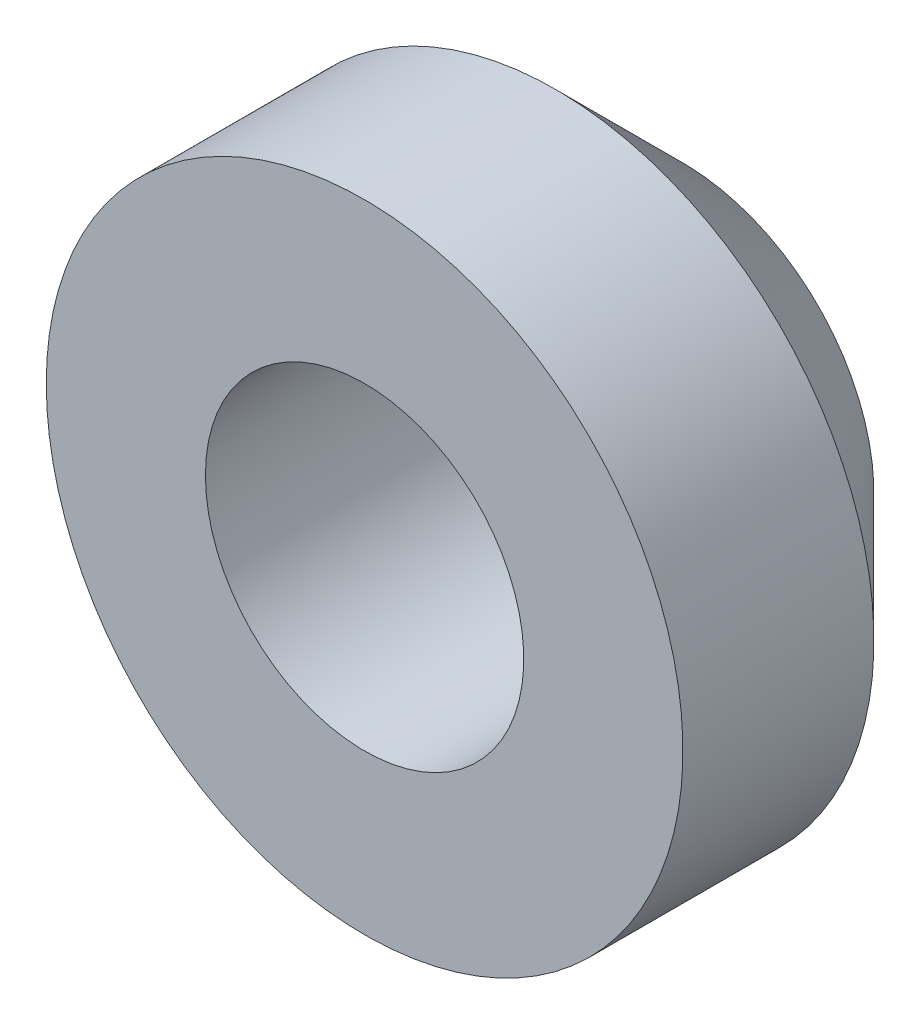
ISO-10303-21;
HEADER;
FILE_DESCRIPTION(('STEP AP214'),'2;1');
FILE_NAME('part.step','',(''),(''),'','','');
FILE_SCHEMA(('AUTOMOTIVE_DESIGN { 1 0 10303 214 1 1 1 1 }'));
ENDSEC;
DATA;
#1=APPLICATION_CONTEXT('core data for automotive mechanical design processes');
#2=APPLICATION_PROTOCOL_DEFINITION('international standard','automotive_design',2000,#1);
#3=PRODUCT_CONTEXT('',#1,'mechanical');
#4=PRODUCT('Part','Part','',(#3));
#5=PRODUCT_RELATED_PRODUCT_CATEGORY('part','',(#4));
#6=PRODUCT_DEFINITION_FORMATION('','',#4);
#7=PRODUCT_DEFINITION_CONTEXT('part definition',#1,'design');
#8=PRODUCT_DEFINITION('design','',#6,#7);
#9=PRODUCT_DEFINITION_SHAPE('','',#8);
#10=(LENGTH_UNIT() NAMED_UNIT(*) SI_UNIT(.MILLI.,.METRE.));
#11=(NAMED_UNIT(*) PLANE_ANGLE_UNIT() SI_UNIT($,.RADIAN.));
#12=(NAMED_UNIT(*) SI_UNIT($,.STERADIAN.) SOLID_ANGLE_UNIT());
#13=UNCERTAINTY_MEASURE_WITH_UNIT(LENGTH_MEASURE(1.E-05),#10,'distance_accuracy_value','');
#14=(GEOMETRIC_REPRESENTATION_CONTEXT(3) GLOBAL_UNCERTAINTY_ASSIGNED_CONTEXT((#13)) GLOBAL_UNIT_ASSIGNED_CONTEXT((#10,
#11,#12)) REPRESENTATION_CONTEXT('',''));
#15=CARTESIAN_POINT('',(0.,0.,0.));
#16=DIRECTION('',(0.,0.,1.));
#17=DIRECTION('',(1.,0.,0.));
#18=AXIS2_PLACEMENT_3D('',#15,#16,#17);
#19=CARTESIAN_POINT('',(59.2983580919048,99.0117521958971,71.2172253642227));
#20=DIRECTION('',(0.,0.,1.));
#21=DIRECTION('',(1.,0.,0.));
#22=AXIS2_PLACEMENT_3D('',#19,#20,#21);
#23=CYLINDRICAL_SURFACE('',#22,5.);
#24=CARTESIAN_POINT('',(59.2983580919048,99.0117521958971,73.2172253642228));
#25=DIRECTION('',(0.,0.,-1.));
#26=DIRECTION('',(-1.,0.,0.));
#27=AXIS2_PLACEMENT_3D('',#24,#25,#26);
#28=CIRCLE('',#27,5.);
#29=CARTESIAN_POINT('',(54.2983580919048,99.0117521958971,73.2172253642227));
#30=VERTEX_POINT('',#29);
#31=EDGE_CURVE('E10',#30,#30,#28,.F.);
#32=ORIENTED_EDGE('',*,*,#31,.T.);
#33=EDGE_LOOP('',(#32));
#34=FACE_BOUND('',#33,.T.);
#35=CARTESIAN_POINT('',(59.2983580919048,99.0117521958972,76.2172253642227));
#36=DIRECTION('',(0.,0.,-1.));
#37=DIRECTION('',(-1.,0.,0.));
#38=AXIS2_PLACEMENT_3D('',#35,#36,#37);
#39=CIRCLE('',#38,5.);
#40=CARTESIAN_POINT('',(54.2983580919048,99.0117521958972,76.2172253642227));
#41=VERTEX_POINT('',#40);
#42=EDGE_CURVE('E45',#41,#41,#39,.T.);
#43=ORIENTED_EDGE('',*,*,#42,.T.);
#44=EDGE_LOOP('',(#43));
#45=FACE_BOUND('',#44,.T.);
#46=ADVANCED_FACE('F34',(#34,#45),#23,.T.);
#47=CARTESIAN_POINT('',(59.2983580919048,99.0117521958971,71.2172253642227));
#48=DIRECTION('',(0.,0.,-1.));
#49=DIRECTION('',(-1.,0.,0.));
#50=AXIS2_PLACEMENT_3D('',#47,#48,#49);
#51=PLANE('',#50);
#52=CARTESIAN_POINT('',(59.2983580919048,99.0117521958971,71.2172253642227));
#53=DIRECTION('',(0.,0.,-1.));
#54=DIRECTION('',(-1.,0.,0.));
#55=AXIS2_PLACEMENT_3D('',#52,#53,#54);
#56=CIRCLE('',#55,3.);
#57=CARTESIAN_POINT('',(56.2983580919048,99.0117521958971,71.2172253642227));
#58=VERTEX_POINT('',#57);
#59=EDGE_CURVE('E41',#58,#58,#56,.T.);
#60=ORIENTED_EDGE('',*,*,#59,.T.);
#61=EDGE_LOOP('',(#60));
#62=FACE_BOUND('',#61,.T.);
#63=CARTESIAN_POINT('',(59.2983580919048,99.0117521958971,71.2172253642227));
#64=DIRECTION('',(0.,0.,-1.));
#65=DIRECTION('',(-1.,0.,0.));
#66=AXIS2_PLACEMENT_3D('',#63,#64,#65);
#67=CIRCLE('',#66,2.5);
#68=CARTESIAN_POINT('',(56.7983580919048,99.0117521958971,71.2172253642227));
#69=VERTEX_POINT('',#68);
#70=EDGE_CURVE('E53',#69,#69,#67,.T.);
#71=ORIENTED_EDGE('',*,*,#70,.F.);
#72=EDGE_LOOP('',(#71));
#73=FACE_BOUND('',#72,.T.);
#74=ADVANCED_FACE('F61',(#62,#73),#51,.T.);
#75=CARTESIAN_POINT('',(59.2983580919048,99.0117521958972,76.2172253642227));
#76=DIRECTION('',(0.,0.,-1.));
#77=DIRECTION('',(-1.,0.,0.));
#78=AXIS2_PLACEMENT_3D('',#75,#76,#77);
#79=PLANE('',#78);
#80=CARTESIAN_POINT('',(59.2983580919048,99.0117521958972,76.2172253642227));
#81=DIRECTION('',(0.,0.,-1.));
#82=DIRECTION('',(-1.,0.,0.));
#83=AXIS2_PLACEMENT_3D('',#80,#81,#82);
#84=CIRCLE('',#83,2.5);
#85=CARTESIAN_POINT('',(56.7983580919048,99.0117521958972,76.2172253642227));
#86=VERTEX_POINT('',#85);
#87=EDGE_CURVE('E49',#86,#86,#84,.T.);
#88=ORIENTED_EDGE('',*,*,#87,.T.);
#89=EDGE_LOOP('',(#88));
#90=FACE_BOUND('',#89,.T.);
#91=ORIENTED_EDGE('',*,*,#42,.F.);
#92=EDGE_LOOP('',(#91));
#93=FACE_BOUND('',#92,.T.);
#94=ADVANCED_FACE('F63',(#90,#93),#79,.F.);
#95=CARTESIAN_POINT('',(59.2983580919047,99.0117521958972,86.2172253642227));
#96=DIRECTION('',(0.,0.,-1.));
#97=DIRECTION('',(-1.,0.,0.));
#98=AXIS2_PLACEMENT_3D('',#95,#96,#97);
#99=CYLINDRICAL_SURFACE('',#98,2.5);
#100=ORIENTED_EDGE('',*,*,#70,.T.);
#101=EDGE_LOOP('',(#100));
#102=FACE_BOUND('',#101,.T.);
#103=ORIENTED_EDGE('',*,*,#87,.F.);
#104=EDGE_LOOP('',(#103));
#105=FACE_BOUND('',#104,.T.);
#106=ADVANCED_FACE('F58',(#102,#105),#99,.F.);
#107=CARTESIAN_POINT('',(59.2983580919048,99.0117521958971,71.2172253642227));
#108=DIRECTION('',(0.,0.,1.));
#109=DIRECTION('',(1.,0.,0.));
#110=AXIS2_PLACEMENT_3D('',#107,#108,#109);
#111=CONICAL_SURFACE('',#110,3.,0.785398163397447);
#112=ORIENTED_EDGE('',*,*,#31,.F.);
#113=EDGE_LOOP('',(#112));
#114=FACE_BOUND('',#113,.T.);
#115=ORIENTED_EDGE('',*,*,#59,.F.);
#116=EDGE_LOOP('',(#115));
#117=FACE_BOUND('',#116,.T.);
#118=ADVANCED_FACE('F36',(#114,#117),#111,.T.);
#119=CLOSED_SHELL('',(#46,#74,#94,#106,#118));
#120=MANIFOLD_SOLID_BREP('B2',#119);
#121=ADVANCED_BREP_SHAPE_REPRESENTATION('',(#18,#120),#14);
#122=SHAPE_DEFINITION_REPRESENTATION(#9,#121);
ENDSEC;
END-ISO-10303-21;
